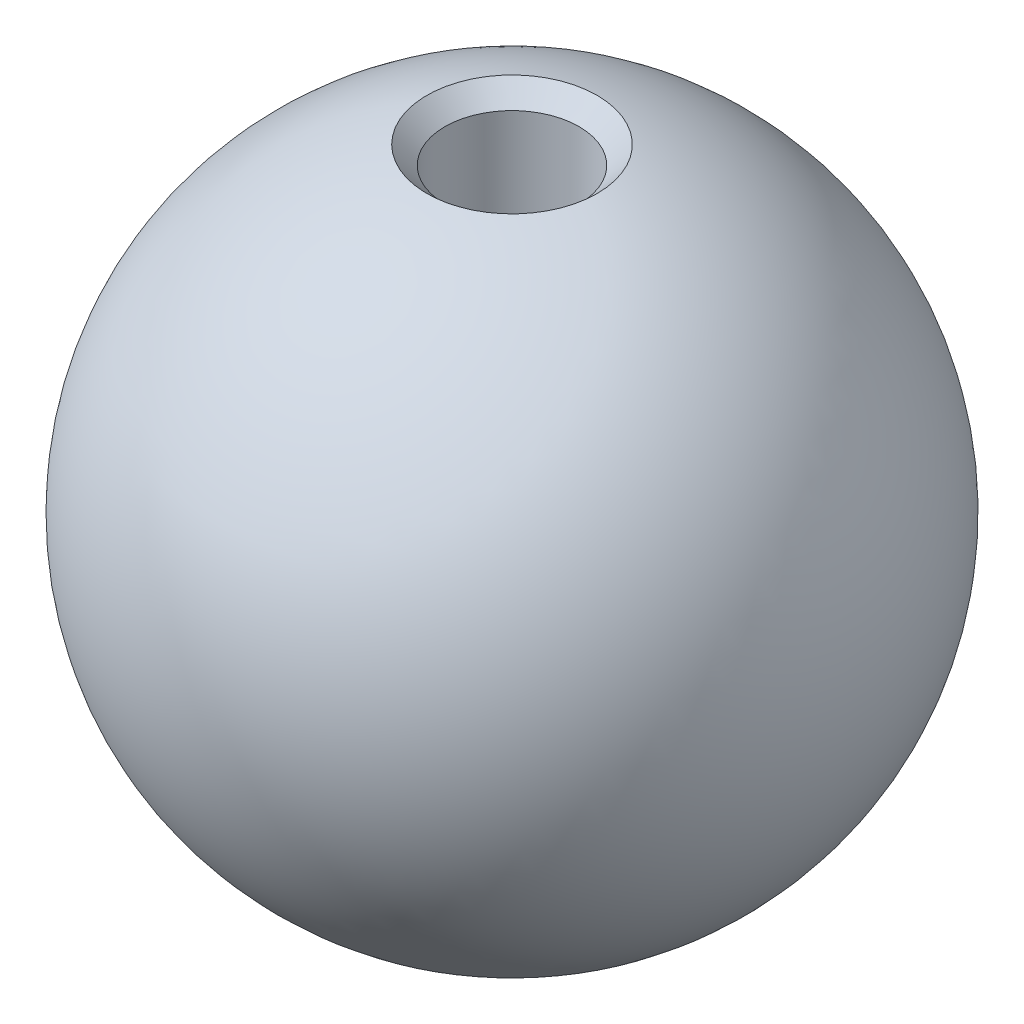
ISO-10303-21;
HEADER;
FILE_DESCRIPTION(('STEP AP214'),'2;1');
FILE_NAME('part.step','',(''),(''),'','','');
FILE_SCHEMA(('AUTOMOTIVE_DESIGN { 1 0 10303 214 1 1 1 1 }'));
ENDSEC;
DATA;
#1=APPLICATION_CONTEXT('core data for automotive mechanical design processes');
#2=APPLICATION_PROTOCOL_DEFINITION('international standard','automotive_design',2000,#1);
#3=PRODUCT_CONTEXT('',#1,'mechanical');
#4=PRODUCT('Part','Part','',(#3));
#5=PRODUCT_RELATED_PRODUCT_CATEGORY('part','',(#4));
#6=PRODUCT_DEFINITION_FORMATION('','',#4);
#7=PRODUCT_DEFINITION_CONTEXT('part definition',#1,'design');
#8=PRODUCT_DEFINITION('design','',#6,#7);
#9=PRODUCT_DEFINITION_SHAPE('','',#8);
#10=(LENGTH_UNIT() NAMED_UNIT(*) SI_UNIT(.MILLI.,.METRE.));
#11=(NAMED_UNIT(*) PLANE_ANGLE_UNIT() SI_UNIT($,.RADIAN.));
#12=(NAMED_UNIT(*) SI_UNIT($,.STERADIAN.) SOLID_ANGLE_UNIT());
#13=UNCERTAINTY_MEASURE_WITH_UNIT(LENGTH_MEASURE(1.E-05),#10,'distance_accuracy_value','');
#14=(GEOMETRIC_REPRESENTATION_CONTEXT(3) GLOBAL_UNCERTAINTY_ASSIGNED_CONTEXT((#13)) GLOBAL_UNIT_ASSIGNED_CONTEXT((#10,
#11,#12)) REPRESENTATION_CONTEXT('',''));
#15=CARTESIAN_POINT('',(0.,0.,0.));
#16=DIRECTION('',(0.,0.,1.));
#17=DIRECTION('',(1.,0.,0.));
#18=AXIS2_PLACEMENT_3D('',#15,#16,#17);
#19=CARTESIAN_POINT('',(0.,0.,0.));
#20=DIRECTION('',(0.,1.,0.));
#21=DIRECTION('',(1.,0.,0.));
#22=AXIS2_PLACEMENT_3D('',#19,#20,#21);
#23=SPHERICAL_SURFACE('',#22,14.75);
#24=CARTESIAN_POINT('',(0.,14.2499113606438,0.));
#25=DIRECTION('',(0.,-1.,0.));
#26=DIRECTION('',(0.,0.,-1.));
#27=AXIS2_PLACEMENT_3D('',#24,#25,#26);
#28=CIRCLE('',#27,3.8082182466076);
#29=CARTESIAN_POINT('',(0.,14.2499113606438,-3.8082182466076));
#30=VERTEX_POINT('',#29);
#31=EDGE_CURVE('E49',#30,#30,#28,.T.);
#32=ORIENTED_EDGE('',*,*,#31,.T.);
#33=EDGE_LOOP('',(#32));
#34=FACE_BOUND('',#33,.T.);
#35=ADVANCED_FACE('F34',(#34),#23,.T.);
#36=CARTESIAN_POINT('',(0.,-5.25,0.));
#37=DIRECTION('',(0.,1.,0.));
#38=DIRECTION('',(0.,0.,1.));
#39=AXIS2_PLACEMENT_3D('',#36,#37,#38);
#40=CYLINDRICAL_SURFACE('',#39,3.);
#41=CARTESIAN_POINT('',(0.,-4.25,0.));
#42=DIRECTION('',(0.,1.,0.));
#43=DIRECTION('',(0.,0.,1.));
#44=AXIS2_PLACEMENT_3D('',#41,#42,#43);
#45=CIRCLE('',#44,3.);
#46=CARTESIAN_POINT('',(0.,-4.25,3.));
#47=VERTEX_POINT('',#46);
#48=EDGE_CURVE('E10',#47,#47,#45,.F.);
#49=ORIENTED_EDGE('',*,*,#48,.T.);
#50=EDGE_LOOP('',(#49));
#51=FACE_BOUND('',#50,.T.);
#52=CARTESIAN_POINT('',(0.,13.4416931140362,0.));
#53=DIRECTION('',(0.,-1.,0.));
#54=DIRECTION('',(0.,0.,-1.));
#55=AXIS2_PLACEMENT_3D('',#52,#53,#54);
#56=CIRCLE('',#55,3.);
#57=CARTESIAN_POINT('',(0.,13.4416931140362,-3.));
#58=VERTEX_POINT('',#57);
#59=EDGE_CURVE('E45',#58,#58,#56,.F.);
#60=ORIENTED_EDGE('',*,*,#59,.T.);
#61=EDGE_LOOP('',(#60));
#62=FACE_BOUND('',#61,.T.);
#63=ADVANCED_FACE('F65',(#51,#62),#40,.F.);
#64=CARTESIAN_POINT('',(0.,-5.25,0.));
#65=DIRECTION('',(0.,1.,0.));
#66=DIRECTION('',(0.,0.,1.));
#67=AXIS2_PLACEMENT_3D('',#64,#65,#66);
#68=PLANE('',#67);
#69=CARTESIAN_POINT('',(0.,-5.25,0.));
#70=DIRECTION('',(0.,1.,0.));
#71=DIRECTION('',(0.,0.,1.));
#72=AXIS2_PLACEMENT_3D('',#69,#70,#71);
#73=CIRCLE('',#72,1.99999999999998);
#74=CARTESIAN_POINT('',(0.,-5.25,1.99999999999998));
#75=VERTEX_POINT('',#74);
#76=EDGE_CURVE('E41',#75,#75,#73,.T.);
#77=ORIENTED_EDGE('',*,*,#76,.T.);
#78=EDGE_LOOP('',(#77));
#79=FACE_BOUND('',#78,.T.);
#80=ADVANCED_FACE('F58',(#79),#68,.T.);
#81=CARTESIAN_POINT('',(0.,14.2499113606438,0.));
#82=DIRECTION('',(0.,1.,0.));
#83=DIRECTION('',(0.,0.,1.));
#84=AXIS2_PLACEMENT_3D('',#81,#82,#83);
#85=CONICAL_SURFACE('',#84,3.8082182466076,0.785398163397445);
#86=ORIENTED_EDGE('',*,*,#59,.F.);
#87=EDGE_LOOP('',(#86));
#88=FACE_BOUND('',#87,.T.);
#89=ORIENTED_EDGE('',*,*,#31,.F.);
#90=EDGE_LOOP('',(#89));
#91=FACE_BOUND('',#90,.T.);
#92=ADVANCED_FACE('F56',(#88,#91),#85,.F.);
#93=CARTESIAN_POINT('',(0.,-5.25,0.));
#94=DIRECTION('',(0.,1.,0.));
#95=DIRECTION('',(0.,0.,1.));
#96=AXIS2_PLACEMENT_3D('',#93,#94,#95);
#97=CONICAL_SURFACE('',#96,1.99999999999998,0.785398163397457);
#98=ORIENTED_EDGE('',*,*,#48,.F.);
#99=EDGE_LOOP('',(#98));
#100=FACE_BOUND('',#99,.T.);
#101=ORIENTED_EDGE('',*,*,#76,.F.);
#102=EDGE_LOOP('',(#101));
#103=FACE_BOUND('',#102,.T.);
#104=ADVANCED_FACE('F36',(#100,#103),#97,.F.);
#105=CLOSED_SHELL('',(#35,#63,#80,#92,#104));
#106=MANIFOLD_SOLID_BREP('B2',#105);
#107=ADVANCED_BREP_SHAPE_REPRESENTATION('',(#18,#106),#14);
#108=SHAPE_DEFINITION_REPRESENTATION(#9,#107);
ENDSEC;
END-ISO-10303-21;
